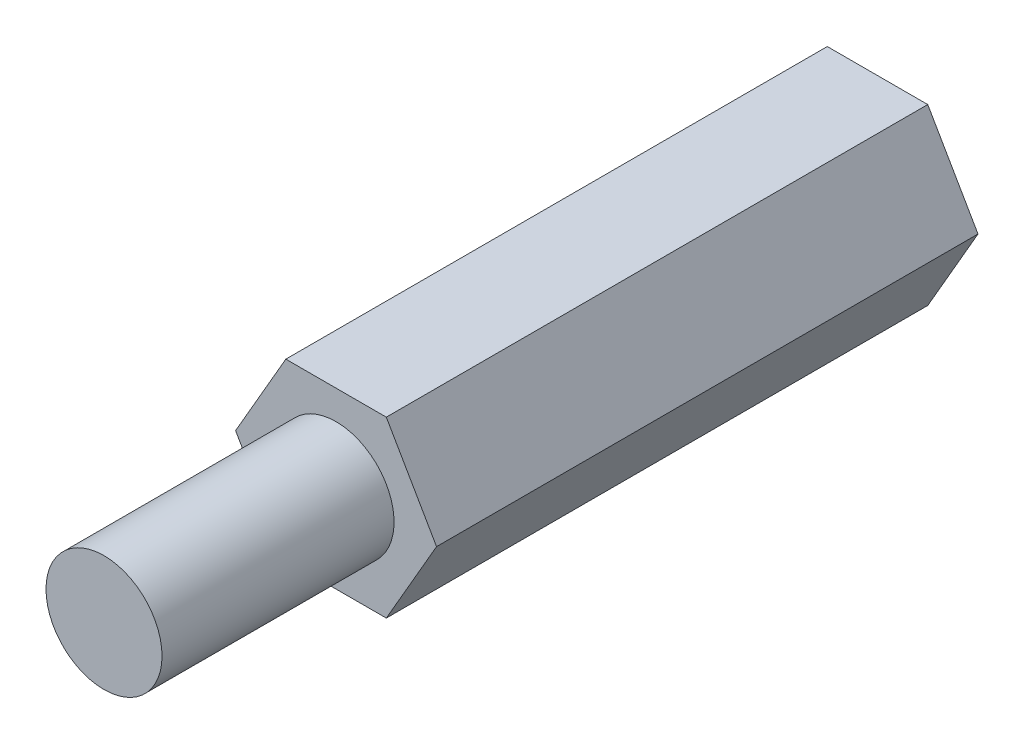
ISO-10303-21;
HEADER;
FILE_DESCRIPTION(('STEP AP214'),'2;1');
FILE_NAME('part.step','',(''),(''),'','','');
FILE_SCHEMA(('AUTOMOTIVE_DESIGN { 1 0 10303 214 1 1 1 1 }'));
ENDSEC;
DATA;
#1=APPLICATION_CONTEXT('core data for automotive mechanical design processes');
#2=APPLICATION_PROTOCOL_DEFINITION('international standard','automotive_design',2000,#1);
#3=PRODUCT_CONTEXT('',#1,'mechanical');
#4=PRODUCT('Part','Part','',(#3));
#5=PRODUCT_RELATED_PRODUCT_CATEGORY('part','',(#4));
#6=PRODUCT_DEFINITION_FORMATION('','',#4);
#7=PRODUCT_DEFINITION_CONTEXT('part definition',#1,'design');
#8=PRODUCT_DEFINITION('design','',#6,#7);
#9=PRODUCT_DEFINITION_SHAPE('','',#8);
#10=(LENGTH_UNIT() NAMED_UNIT(*) SI_UNIT(.MILLI.,.METRE.));
#11=(NAMED_UNIT(*) PLANE_ANGLE_UNIT() SI_UNIT($,.RADIAN.));
#12=(NAMED_UNIT(*) SI_UNIT($,.STERADIAN.) SOLID_ANGLE_UNIT());
#13=UNCERTAINTY_MEASURE_WITH_UNIT(LENGTH_MEASURE(1.E-05),#10,'distance_accuracy_value','');
#14=(GEOMETRIC_REPRESENTATION_CONTEXT(3) GLOBAL_UNCERTAINTY_ASSIGNED_CONTEXT((#13)) GLOBAL_UNIT_ASSIGNED_CONTEXT((#10,
#11,#12)) REPRESENTATION_CONTEXT('',''));
#15=CARTESIAN_POINT('',(0.,0.,0.));
#16=DIRECTION('',(0.,0.,1.));
#17=DIRECTION('',(1.,0.,0.));
#18=AXIS2_PLACEMENT_3D('',#15,#16,#17);
#19=CARTESIAN_POINT('',(0.,0.,6.));
#20=DIRECTION('',(0.,0.,-1.));
#21=DIRECTION('',(-1.,0.,0.));
#22=AXIS2_PLACEMENT_3D('',#19,#20,#21);
#23=CYLINDRICAL_SURFACE('',#22,1.5);
#24=CARTESIAN_POINT('',(0.,0.,6.));
#25=DIRECTION('',(0.,0.,1.));
#26=DIRECTION('',(1.,0.,0.));
#27=AXIS2_PLACEMENT_3D('',#24,#25,#26);
#28=CIRCLE('',#27,1.5);
#29=CARTESIAN_POINT('',(1.5,0.,6.));
#30=VERTEX_POINT('',#29);
#31=EDGE_CURVE('E11',#30,#30,#28,.T.);
#32=ORIENTED_EDGE('',*,*,#31,.F.);
#33=EDGE_LOOP('',(#32));
#34=FACE_BOUND('',#33,.T.);
#35=CARTESIAN_POINT('',(0.,0.,0.));
#36=DIRECTION('',(0.,0.,-1.));
#37=DIRECTION('',(-1.,0.,0.));
#38=AXIS2_PLACEMENT_3D('',#35,#36,#37);
#39=CIRCLE('',#38,1.5);
#40=CARTESIAN_POINT('',(-1.5,0.,0.));
#41=VERTEX_POINT('',#40);
#42=EDGE_CURVE('E45',#41,#41,#39,.T.);
#43=ORIENTED_EDGE('',*,*,#42,.F.);
#44=EDGE_LOOP('',(#43));
#45=FACE_BOUND('',#44,.T.);
#46=ADVANCED_FACE('F37',(#34,#45),#23,.T.);
#47=CARTESIAN_POINT('',(0.,0.,6.));
#48=DIRECTION('',(0.,0.,1.));
#49=DIRECTION('',(1.,0.,0.));
#50=AXIS2_PLACEMENT_3D('',#47,#48,#49);
#51=PLANE('',#50);
#52=ORIENTED_EDGE('',*,*,#31,.T.);
#53=EDGE_LOOP('',(#52));
#54=FACE_BOUND('',#53,.T.);
#55=ADVANCED_FACE('F147',(#54),#51,.T.);
#56=CARTESIAN_POINT('',(0.,0.,0.));
#57=DIRECTION('',(0.,0.,-1.));
#58=DIRECTION('',(-1.,0.,0.));
#59=AXIS2_PLACEMENT_3D('',#56,#57,#58);
#60=PLANE('',#59);
#61=DIRECTION('',(0.5,0.866025403784439,0.));
#62=VECTOR('',#61,1.);
#63=CARTESIAN_POINT('',(-2.59807621135332,0.,0.));
#64=LINE('',#63,#62);
#65=CARTESIAN_POINT('',(-2.59807621135332,0.,0.));
#66=VERTEX_POINT('',#65);
#67=CARTESIAN_POINT('',(-1.29903810567666,2.25,0.));
#68=VERTEX_POINT('',#67);
#69=EDGE_CURVE('E122',#66,#68,#64,.T.);
#70=ORIENTED_EDGE('',*,*,#69,.F.);
#71=DIRECTION('',(-0.5,0.866025403784439,0.));
#72=VECTOR('',#71,1.);
#73=CARTESIAN_POINT('',(-1.29903810567666,-2.25,0.));
#74=LINE('',#73,#72);
#75=CARTESIAN_POINT('',(-1.29903810567666,-2.25,0.));
#76=VERTEX_POINT('',#75);
#77=EDGE_CURVE('E82',#76,#66,#74,.T.);
#78=ORIENTED_EDGE('',*,*,#77,.F.);
#79=DIRECTION('',(-1.,0.,0.));
#80=VECTOR('',#79,1.);
#81=CARTESIAN_POINT('',(1.29903810567666,-2.25,0.));
#82=LINE('',#81,#80);
#83=CARTESIAN_POINT('',(1.29903810567666,-2.25,0.));
#84=VERTEX_POINT('',#83);
#85=EDGE_CURVE('E76',#84,#76,#82,.T.);
#86=ORIENTED_EDGE('',*,*,#85,.F.);
#87=DIRECTION('',(-0.5,-0.866025403784438,0.));
#88=VECTOR('',#87,1.);
#89=CARTESIAN_POINT('',(2.59807621135332,0.,0.));
#90=LINE('',#89,#88);
#91=CARTESIAN_POINT('',(2.59807621135332,0.,0.));
#92=VERTEX_POINT('',#91);
#93=EDGE_CURVE('E112',#92,#84,#90,.T.);
#94=ORIENTED_EDGE('',*,*,#93,.F.);
#95=DIRECTION('',(0.5,-0.866025403784439,0.));
#96=VECTOR('',#95,1.);
#97=CARTESIAN_POINT('',(1.29903810567666,2.25,0.));
#98=LINE('',#97,#96);
#99=CARTESIAN_POINT('',(1.29903810567666,2.25,0.));
#100=VERTEX_POINT('',#99);
#101=EDGE_CURVE('E128',#100,#92,#98,.T.);
#102=ORIENTED_EDGE('',*,*,#101,.F.);
#103=DIRECTION('',(1.,0.,0.));
#104=VECTOR('',#103,1.);
#105=CARTESIAN_POINT('',(-1.29903810567666,2.25,0.));
#106=LINE('',#105,#104);
#107=EDGE_CURVE('E125',#68,#100,#106,.T.);
#108=ORIENTED_EDGE('',*,*,#107,.F.);
#109=EDGE_LOOP('',(#70,#78,#86,#94,#102,#108));
#110=FACE_BOUND('',#109,.T.);
#111=ORIENTED_EDGE('',*,*,#42,.T.);
#112=EDGE_LOOP('',(#111));
#113=FACE_BOUND('',#112,.T.);
#114=ADVANCED_FACE('F144',(#110,#113),#60,.F.);
#115=CARTESIAN_POINT('',(-2.59807621135332,0.,-14.));
#116=DIRECTION('',(0.866025403784439,-0.5,0.));
#117=DIRECTION('',(0.5,0.866025403784439,0.));
#118=AXIS2_PLACEMENT_3D('',#115,#116,#117);
#119=PLANE('',#118);
#120=ORIENTED_EDGE('',*,*,#69,.T.);
#121=DIRECTION('',(0.,0.,1.));
#122=VECTOR('',#121,1.);
#123=CARTESIAN_POINT('',(-1.29903810567666,2.25,-14.));
#124=LINE('',#123,#122);
#125=CARTESIAN_POINT('',(-1.29903810567666,2.25,-14.));
#126=VERTEX_POINT('',#125);
#127=EDGE_CURVE('E140',#126,#68,#124,.T.);
#128=ORIENTED_EDGE('',*,*,#127,.F.);
#129=DIRECTION('',(0.5,0.866025403784439,0.));
#130=VECTOR('',#129,1.);
#131=CARTESIAN_POINT('',(-2.59807621135332,0.,-14.));
#132=LINE('',#131,#130);
#133=CARTESIAN_POINT('',(-2.59807621135332,0.,-14.));
#134=VERTEX_POINT('',#133);
#135=EDGE_CURVE('E133',#134,#126,#132,.T.);
#136=ORIENTED_EDGE('',*,*,#135,.F.);
#137=DIRECTION('',(0.,0.,1.));
#138=VECTOR('',#137,1.);
#139=CARTESIAN_POINT('',(-2.59807621135332,0.,-14.));
#140=LINE('',#139,#138);
#141=EDGE_CURVE('E118',#134,#66,#140,.T.);
#142=ORIENTED_EDGE('',*,*,#141,.T.);
#143=EDGE_LOOP('',(#120,#128,#136,#142));
#144=FACE_BOUND('',#143,.T.);
#145=ADVANCED_FACE('F157',(#144),#119,.F.);
#146=CARTESIAN_POINT('',(-1.29903810567666,2.25,-14.));
#147=DIRECTION('',(0.,-1.,0.));
#148=DIRECTION('',(0.,0.,-1.));
#149=AXIS2_PLACEMENT_3D('',#146,#147,#148);
#150=PLANE('',#149);
#151=ORIENTED_EDGE('',*,*,#107,.T.);
#152=DIRECTION('',(0.,0.,1.));
#153=VECTOR('',#152,1.);
#154=CARTESIAN_POINT('',(1.29903810567666,2.25,-14.));
#155=LINE('',#154,#153);
#156=CARTESIAN_POINT('',(1.29903810567666,2.25,-14.));
#157=VERTEX_POINT('',#156);
#158=EDGE_CURVE('E137',#157,#100,#155,.T.);
#159=ORIENTED_EDGE('',*,*,#158,.F.);
#160=DIRECTION('',(1.,0.,0.));
#161=VECTOR('',#160,1.);
#162=CARTESIAN_POINT('',(-1.29903810567666,2.25,-14.));
#163=LINE('',#162,#161);
#164=EDGE_CURVE('E91',#126,#157,#163,.T.);
#165=ORIENTED_EDGE('',*,*,#164,.F.);
#166=ORIENTED_EDGE('',*,*,#127,.T.);
#167=EDGE_LOOP('',(#151,#159,#165,#166));
#168=FACE_BOUND('',#167,.T.);
#169=ADVANCED_FACE('F163',(#168),#150,.F.);
#170=CARTESIAN_POINT('',(1.29903810567666,2.25,-14.));
#171=DIRECTION('',(-0.866025403784439,-0.5,0.));
#172=DIRECTION('',(0.5,-0.866025403784439,0.));
#173=AXIS2_PLACEMENT_3D('',#170,#171,#172);
#174=PLANE('',#173);
#175=ORIENTED_EDGE('',*,*,#101,.T.);
#176=DIRECTION('',(0.,0.,1.));
#177=VECTOR('',#176,1.);
#178=CARTESIAN_POINT('',(2.59807621135332,0.,-14.));
#179=LINE('',#178,#177);
#180=CARTESIAN_POINT('',(2.59807621135332,0.,-14.));
#181=VERTEX_POINT('',#180);
#182=EDGE_CURVE('E113',#181,#92,#179,.T.);
#183=ORIENTED_EDGE('',*,*,#182,.F.);
#184=DIRECTION('',(0.5,-0.866025403784439,0.));
#185=VECTOR('',#184,1.);
#186=CARTESIAN_POINT('',(1.29903810567666,2.25,-14.));
#187=LINE('',#186,#185);
#188=EDGE_CURVE('E104',#157,#181,#187,.T.);
#189=ORIENTED_EDGE('',*,*,#188,.F.);
#190=ORIENTED_EDGE('',*,*,#158,.T.);
#191=EDGE_LOOP('',(#175,#183,#189,#190));
#192=FACE_BOUND('',#191,.T.);
#193=ADVANCED_FACE('F167',(#192),#174,.F.);
#194=CARTESIAN_POINT('',(2.59807621135332,0.,-14.));
#195=DIRECTION('',(-0.866025403784438,0.5,0.));
#196=DIRECTION('',(-0.5,-0.866025403784438,0.));
#197=AXIS2_PLACEMENT_3D('',#194,#195,#196);
#198=PLANE('',#197);
#199=ORIENTED_EDGE('',*,*,#93,.T.);
#200=DIRECTION('',(0.,0.,1.));
#201=VECTOR('',#200,1.);
#202=CARTESIAN_POINT('',(1.29903810567666,-2.25,-14.));
#203=LINE('',#202,#201);
#204=CARTESIAN_POINT('',(1.29903810567666,-2.25,-14.));
#205=VERTEX_POINT('',#204);
#206=EDGE_CURVE('E109',#205,#84,#203,.T.);
#207=ORIENTED_EDGE('',*,*,#206,.F.);
#208=DIRECTION('',(-0.5,-0.866025403784438,0.));
#209=VECTOR('',#208,1.);
#210=CARTESIAN_POINT('',(2.59807621135332,0.,-14.));
#211=LINE('',#210,#209);
#212=EDGE_CURVE('E98',#181,#205,#211,.T.);
#213=ORIENTED_EDGE('',*,*,#212,.F.);
#214=ORIENTED_EDGE('',*,*,#182,.T.);
#215=EDGE_LOOP('',(#199,#207,#213,#214));
#216=FACE_BOUND('',#215,.T.);
#217=ADVANCED_FACE('F110',(#216),#198,.F.);
#218=CARTESIAN_POINT('',(1.29903810567666,-2.25,-14.));
#219=DIRECTION('',(0.,1.,0.));
#220=DIRECTION('',(-1.,0.,0.));
#221=AXIS2_PLACEMENT_3D('',#218,#219,#220);
#222=PLANE('',#221);
#223=ORIENTED_EDGE('',*,*,#85,.T.);
#224=DIRECTION('',(0.,0.,1.));
#225=VECTOR('',#224,1.);
#226=CARTESIAN_POINT('',(-1.29903810567666,-2.25,-14.));
#227=LINE('',#226,#225);
#228=CARTESIAN_POINT('',(-1.29903810567666,-2.25,-14.));
#229=VERTEX_POINT('',#228);
#230=EDGE_CURVE('E114',#229,#76,#227,.T.);
#231=ORIENTED_EDGE('',*,*,#230,.F.);
#232=DIRECTION('',(-1.,0.,0.));
#233=VECTOR('',#232,1.);
#234=CARTESIAN_POINT('',(1.29903810567666,-2.25,-14.));
#235=LINE('',#234,#233);
#236=EDGE_CURVE('E102',#205,#229,#235,.T.);
#237=ORIENTED_EDGE('',*,*,#236,.F.);
#238=ORIENTED_EDGE('',*,*,#206,.T.);
#239=EDGE_LOOP('',(#223,#231,#237,#238));
#240=FACE_BOUND('',#239,.T.);
#241=ADVANCED_FACE('F116',(#240),#222,.F.);
#242=CARTESIAN_POINT('',(-1.29903810567666,-2.25,-14.));
#243=DIRECTION('',(0.866025403784439,0.5,0.));
#244=DIRECTION('',(-0.5,0.866025403784439,0.));
#245=AXIS2_PLACEMENT_3D('',#242,#243,#244);
#246=PLANE('',#245);
#247=ORIENTED_EDGE('',*,*,#77,.T.);
#248=ORIENTED_EDGE('',*,*,#141,.F.);
#249=DIRECTION('',(-0.5,0.866025403784439,0.));
#250=VECTOR('',#249,1.);
#251=CARTESIAN_POINT('',(-1.29903810567666,-2.25,-14.));
#252=LINE('',#251,#250);
#253=EDGE_CURVE('E53',#229,#134,#252,.T.);
#254=ORIENTED_EDGE('',*,*,#253,.F.);
#255=ORIENTED_EDGE('',*,*,#230,.T.);
#256=EDGE_LOOP('',(#247,#248,#254,#255));
#257=FACE_BOUND('',#256,.T.);
#258=ADVANCED_FACE('F175',(#257),#246,.F.);
#259=CARTESIAN_POINT('',(0.,0.,-14.));
#260=DIRECTION('',(0.,0.,-1.));
#261=DIRECTION('',(-1.,0.,0.));
#262=AXIS2_PLACEMENT_3D('',#259,#260,#261);
#263=PLANE('',#262);
#264=CARTESIAN_POINT('',(0.,0.,-14.));
#265=DIRECTION('',(0.,0.,-1.));
#266=DIRECTION('',(-1.,0.,0.));
#267=AXIS2_PLACEMENT_3D('',#264,#265,#266);
#268=CIRCLE('',#267,1.5);
#269=CARTESIAN_POINT('',(-1.5,0.,-14.));
#270=VERTEX_POINT('',#269);
#271=EDGE_CURVE('E192',#270,#270,#268,.T.);
#272=ORIENTED_EDGE('',*,*,#271,.F.);
#273=EDGE_LOOP('',(#272));
#274=FACE_BOUND('',#273,.T.);
#275=ORIENTED_EDGE('',*,*,#135,.T.);
#276=ORIENTED_EDGE('',*,*,#164,.T.);
#277=ORIENTED_EDGE('',*,*,#188,.T.);
#278=ORIENTED_EDGE('',*,*,#212,.T.);
#279=ORIENTED_EDGE('',*,*,#236,.T.);
#280=ORIENTED_EDGE('',*,*,#253,.T.);
#281=EDGE_LOOP('',(#275,#276,#277,#278,#279,#280));
#282=FACE_BOUND('',#281,.T.);
#283=ADVANCED_FACE('F100',(#274,#282),#263,.T.);
#284=CARTESIAN_POINT('',(0.,0.,-9.5));
#285=DIRECTION('',(0.,0.,-1.));
#286=DIRECTION('',(-1.,0.,0.));
#287=AXIS2_PLACEMENT_3D('',#284,#285,#286);
#288=CYLINDRICAL_SURFACE('',#287,1.5);
#289=CARTESIAN_POINT('',(0.,0.,-9.5));
#290=DIRECTION('',(0.,0.,-1.));
#291=DIRECTION('',(-1.,0.,0.));
#292=AXIS2_PLACEMENT_3D('',#289,#290,#291);
#293=CIRCLE('',#292,1.5);
#294=CARTESIAN_POINT('',(-1.5,0.,-9.5));
#295=VERTEX_POINT('',#294);
#296=EDGE_CURVE('E126',#295,#295,#293,.T.);
#297=ORIENTED_EDGE('',*,*,#296,.F.);
#298=EDGE_LOOP('',(#297));
#299=FACE_BOUND('',#298,.T.);
#300=ORIENTED_EDGE('',*,*,#271,.T.);
#301=EDGE_LOOP('',(#300));
#302=FACE_BOUND('',#301,.T.);
#303=ADVANCED_FACE('F180',(#299,#302),#288,.F.);
#304=CARTESIAN_POINT('',(0.,0.,-9.5));
#305=DIRECTION('',(0.,0.,-1.));
#306=DIRECTION('',(-1.,0.,0.));
#307=AXIS2_PLACEMENT_3D('',#304,#305,#306);
#308=PLANE('',#307);
#309=ORIENTED_EDGE('',*,*,#296,.T.);
#310=EDGE_LOOP('',(#309));
#311=FACE_BOUND('',#310,.T.);
#312=ADVANCED_FACE('F184',(#311),#308,.T.);
#313=CLOSED_SHELL('',(#46,#55,#114,#145,#169,#193,#217,#241,#258,#283,#303,#312));
#314=MANIFOLD_SOLID_BREP('B2',#313);
#315=ADVANCED_BREP_SHAPE_REPRESENTATION('',(#18,#314),#14);
#316=SHAPE_DEFINITION_REPRESENTATION(#9,#315);
ENDSEC;
END-ISO-10303-21;
